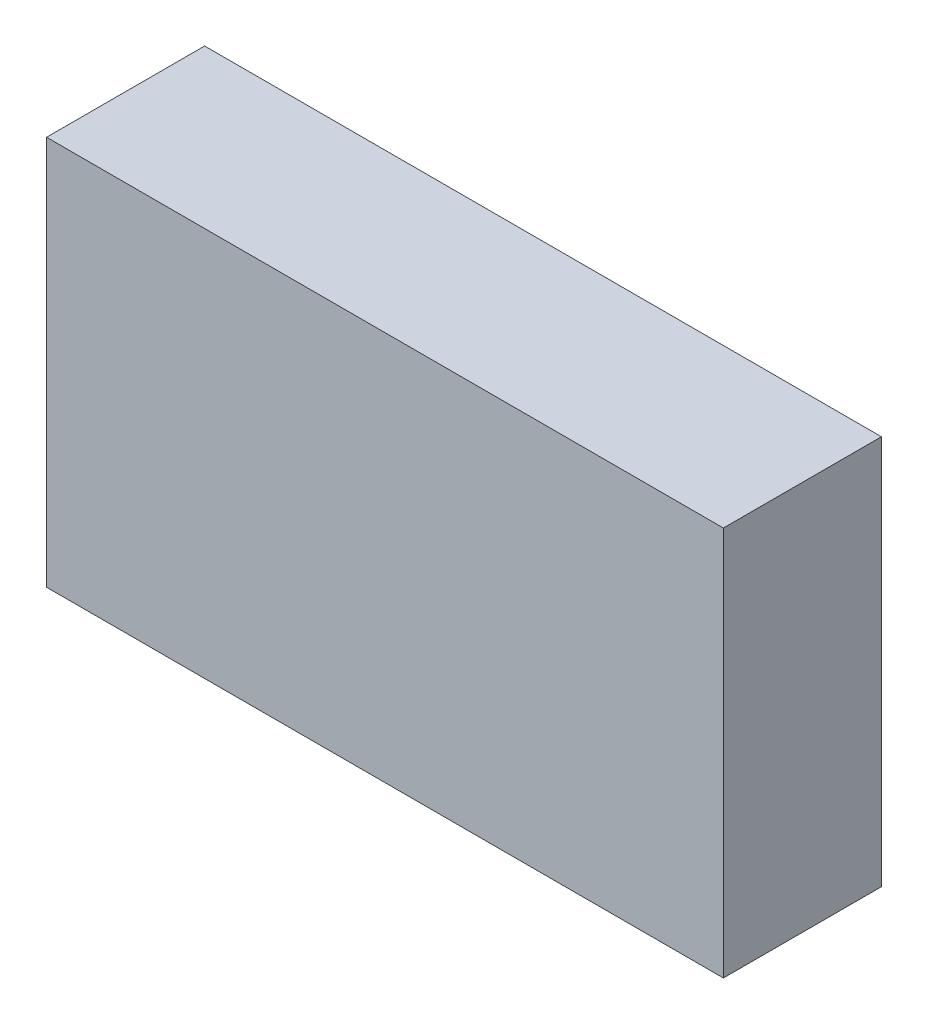
ISO-10303-21;
HEADER;
FILE_DESCRIPTION(('STEP AP214'),'2;1');
FILE_NAME('part.step','',(''),(''),'','','');
FILE_SCHEMA(('AUTOMOTIVE_DESIGN { 1 0 10303 214 1 1 1 1 }'));
ENDSEC;
DATA;
#1=APPLICATION_CONTEXT('core data for automotive mechanical design processes');
#2=APPLICATION_PROTOCOL_DEFINITION('international standard','automotive_design',2000,#1);
#3=PRODUCT_CONTEXT('',#1,'mechanical');
#4=PRODUCT('Part','Part','',(#3));
#5=PRODUCT_RELATED_PRODUCT_CATEGORY('part','',(#4));
#6=PRODUCT_DEFINITION_FORMATION('','',#4);
#7=PRODUCT_DEFINITION_CONTEXT('part definition',#1,'design');
#8=PRODUCT_DEFINITION('design','',#6,#7);
#9=PRODUCT_DEFINITION_SHAPE('','',#8);
#10=(LENGTH_UNIT() NAMED_UNIT(*) SI_UNIT(.MILLI.,.METRE.));
#11=(NAMED_UNIT(*) PLANE_ANGLE_UNIT() SI_UNIT($,.RADIAN.));
#12=(NAMED_UNIT(*) SI_UNIT($,.STERADIAN.) SOLID_ANGLE_UNIT());
#13=UNCERTAINTY_MEASURE_WITH_UNIT(LENGTH_MEASURE(1.E-05),#10,'distance_accuracy_value','');
#14=(GEOMETRIC_REPRESENTATION_CONTEXT(3) GLOBAL_UNCERTAINTY_ASSIGNED_CONTEXT((#13)) GLOBAL_UNIT_ASSIGNED_CONTEXT((#10,
#11,#12)) REPRESENTATION_CONTEXT('',''));
#15=CARTESIAN_POINT('',(0.,0.,0.));
#16=DIRECTION('',(0.,0.,1.));
#17=DIRECTION('',(1.,0.,0.));
#18=AXIS2_PLACEMENT_3D('',#15,#16,#17);
#19=CARTESIAN_POINT('',(0.,0.,7.41));
#20=DIRECTION('',(1.,0.,0.));
#21=DIRECTION('',(0.,0.,-1.));
#22=AXIS2_PLACEMENT_3D('',#19,#20,#21);
#23=PLANE('',#22);
#24=DIRECTION('',(0.,-1.,0.));
#25=VECTOR('',#24,1.);
#26=CARTESIAN_POINT('',(0.,0.,0.));
#27=LINE('',#26,#25);
#28=CARTESIAN_POINT('',(0.,18.27,0.));
#29=VERTEX_POINT('',#28);
#30=CARTESIAN_POINT('',(0.,0.,0.));
#31=VERTEX_POINT('',#30);
#32=EDGE_CURVE('E101',#29,#31,#27,.T.);
#33=ORIENTED_EDGE('',*,*,#32,.T.);
#34=DIRECTION('',(0.,0.,-1.));
#35=VECTOR('',#34,1.);
#36=CARTESIAN_POINT('',(0.,0.,7.41));
#37=LINE('',#36,#35);
#38=CARTESIAN_POINT('',(0.,0.,7.41));
#39=VERTEX_POINT('',#38);
#40=EDGE_CURVE('E11',#39,#31,#37,.T.);
#41=ORIENTED_EDGE('',*,*,#40,.F.);
#42=DIRECTION('',(0.,-1.,0.));
#43=VECTOR('',#42,1.);
#44=CARTESIAN_POINT('',(0.,0.,7.41));
#45=LINE('',#44,#43);
#46=CARTESIAN_POINT('',(0.,18.27,7.41));
#47=VERTEX_POINT('',#46);
#48=EDGE_CURVE('E95',#47,#39,#45,.T.);
#49=ORIENTED_EDGE('',*,*,#48,.F.);
#50=DIRECTION('',(0.,0.,-1.));
#51=VECTOR('',#50,1.);
#52=CARTESIAN_POINT('',(0.,18.27,7.41));
#53=LINE('',#52,#51);
#54=EDGE_CURVE('E99',#47,#29,#53,.T.);
#55=ORIENTED_EDGE('',*,*,#54,.T.);
#56=EDGE_LOOP('',(#33,#41,#49,#55));
#57=FACE_BOUND('',#56,.T.);
#58=ADVANCED_FACE('F41',(#57),#23,.F.);
#59=CARTESIAN_POINT('',(0.,0.,7.41));
#60=DIRECTION('',(0.,1.,0.));
#61=DIRECTION('',(0.,0.,1.));
#62=AXIS2_PLACEMENT_3D('',#59,#60,#61);
#63=PLANE('',#62);
#64=DIRECTION('',(1.,0.,0.));
#65=VECTOR('',#64,1.);
#66=CARTESIAN_POINT('',(0.,0.,0.));
#67=LINE('',#66,#65);
#68=CARTESIAN_POINT('',(31.73,0.,0.));
#69=VERTEX_POINT('',#68);
#70=EDGE_CURVE('E96',#31,#69,#67,.T.);
#71=ORIENTED_EDGE('',*,*,#70,.T.);
#72=DIRECTION('',(0.,0.,-1.));
#73=VECTOR('',#72,1.);
#74=CARTESIAN_POINT('',(31.73,0.,7.41));
#75=LINE('',#74,#73);
#76=CARTESIAN_POINT('',(31.73,0.,7.41));
#77=VERTEX_POINT('',#76);
#78=EDGE_CURVE('E47',#77,#69,#75,.T.);
#79=ORIENTED_EDGE('',*,*,#78,.F.);
#80=DIRECTION('',(1.,0.,0.));
#81=VECTOR('',#80,1.);
#82=CARTESIAN_POINT('',(0.,0.,7.41));
#83=LINE('',#82,#81);
#84=EDGE_CURVE('E90',#39,#77,#83,.T.);
#85=ORIENTED_EDGE('',*,*,#84,.F.);
#86=ORIENTED_EDGE('',*,*,#40,.T.);
#87=EDGE_LOOP('',(#71,#79,#85,#86));
#88=FACE_BOUND('',#87,.T.);
#89=ADVANCED_FACE('F94',(#88),#63,.F.);
#90=CARTESIAN_POINT('',(31.73,0.,7.41));
#91=DIRECTION('',(-1.,0.,0.));
#92=DIRECTION('',(0.,0.,1.));
#93=AXIS2_PLACEMENT_3D('',#90,#91,#92);
#94=PLANE('',#93);
#95=DIRECTION('',(0.,1.,0.));
#96=VECTOR('',#95,1.);
#97=CARTESIAN_POINT('',(31.73,0.,0.));
#98=LINE('',#97,#96);
#99=CARTESIAN_POINT('',(31.73,18.27,0.));
#100=VERTEX_POINT('',#99);
#101=EDGE_CURVE('E74',#69,#100,#98,.T.);
#102=ORIENTED_EDGE('',*,*,#101,.T.);
#103=DIRECTION('',(0.,0.,-1.));
#104=VECTOR('',#103,1.);
#105=CARTESIAN_POINT('',(31.73,18.27,7.41));
#106=LINE('',#105,#104);
#107=CARTESIAN_POINT('',(31.73,18.27,7.41));
#108=VERTEX_POINT('',#107);
#109=EDGE_CURVE('E100',#108,#100,#106,.T.);
#110=ORIENTED_EDGE('',*,*,#109,.F.);
#111=DIRECTION('',(0.,1.,0.));
#112=VECTOR('',#111,1.);
#113=CARTESIAN_POINT('',(31.73,0.,7.41));
#114=LINE('',#113,#112);
#115=EDGE_CURVE('E89',#77,#108,#114,.T.);
#116=ORIENTED_EDGE('',*,*,#115,.F.);
#117=ORIENTED_EDGE('',*,*,#78,.T.);
#118=EDGE_LOOP('',(#102,#110,#116,#117));
#119=FACE_BOUND('',#118,.T.);
#120=ADVANCED_FACE('F97',(#119),#94,.F.);
#121=CARTESIAN_POINT('',(0.,18.27,7.41));
#122=DIRECTION('',(0.,-1.,0.));
#123=DIRECTION('',(0.,0.,-1.));
#124=AXIS2_PLACEMENT_3D('',#121,#122,#123);
#125=PLANE('',#124);
#126=DIRECTION('',(-1.,0.,0.));
#127=VECTOR('',#126,1.);
#128=CARTESIAN_POINT('',(0.,18.27,0.));
#129=LINE('',#128,#127);
#130=EDGE_CURVE('E79',#100,#29,#129,.T.);
#131=ORIENTED_EDGE('',*,*,#130,.T.);
#132=ORIENTED_EDGE('',*,*,#54,.F.);
#133=DIRECTION('',(-1.,0.,0.));
#134=VECTOR('',#133,1.);
#135=CARTESIAN_POINT('',(0.,18.27,7.41));
#136=LINE('',#135,#134);
#137=EDGE_CURVE('E60',#108,#47,#136,.T.);
#138=ORIENTED_EDGE('',*,*,#137,.F.);
#139=ORIENTED_EDGE('',*,*,#109,.T.);
#140=EDGE_LOOP('',(#131,#132,#138,#139));
#141=FACE_BOUND('',#140,.T.);
#142=ADVANCED_FACE('F112',(#141),#125,.F.);
#143=CARTESIAN_POINT('',(0.,0.,7.41));
#144=DIRECTION('',(0.,0.,-1.));
#145=DIRECTION('',(-1.,0.,0.));
#146=AXIS2_PLACEMENT_3D('',#143,#144,#145);
#147=PLANE('',#146);
#148=ORIENTED_EDGE('',*,*,#48,.T.);
#149=ORIENTED_EDGE('',*,*,#84,.T.);
#150=ORIENTED_EDGE('',*,*,#115,.T.);
#151=ORIENTED_EDGE('',*,*,#137,.T.);
#152=EDGE_LOOP('',(#148,#149,#150,#151));
#153=FACE_BOUND('',#152,.T.);
#154=ADVANCED_FACE('F88',(#153),#147,.F.);
#155=CARTESIAN_POINT('',(0.,0.,0.));
#156=DIRECTION('',(0.,0.,-1.));
#157=DIRECTION('',(-1.,0.,0.));
#158=AXIS2_PLACEMENT_3D('',#155,#156,#157);
#159=PLANE('',#158);
#160=ORIENTED_EDGE('',*,*,#32,.F.);
#161=ORIENTED_EDGE('',*,*,#130,.F.);
#162=ORIENTED_EDGE('',*,*,#101,.F.);
#163=ORIENTED_EDGE('',*,*,#70,.F.);
#164=EDGE_LOOP('',(#160,#161,#162,#163));
#165=FACE_BOUND('',#164,.T.);
#166=ADVANCED_FACE('F114',(#165),#159,.T.);
#167=CLOSED_SHELL('',(#58,#89,#120,#142,#154,#166));
#168=MANIFOLD_SOLID_BREP('B2',#167);
#169=ADVANCED_BREP_SHAPE_REPRESENTATION('',(#18,#168),#14);
#170=SHAPE_DEFINITION_REPRESENTATION(#9,#169);
ENDSEC;
END-ISO-10303-21;
